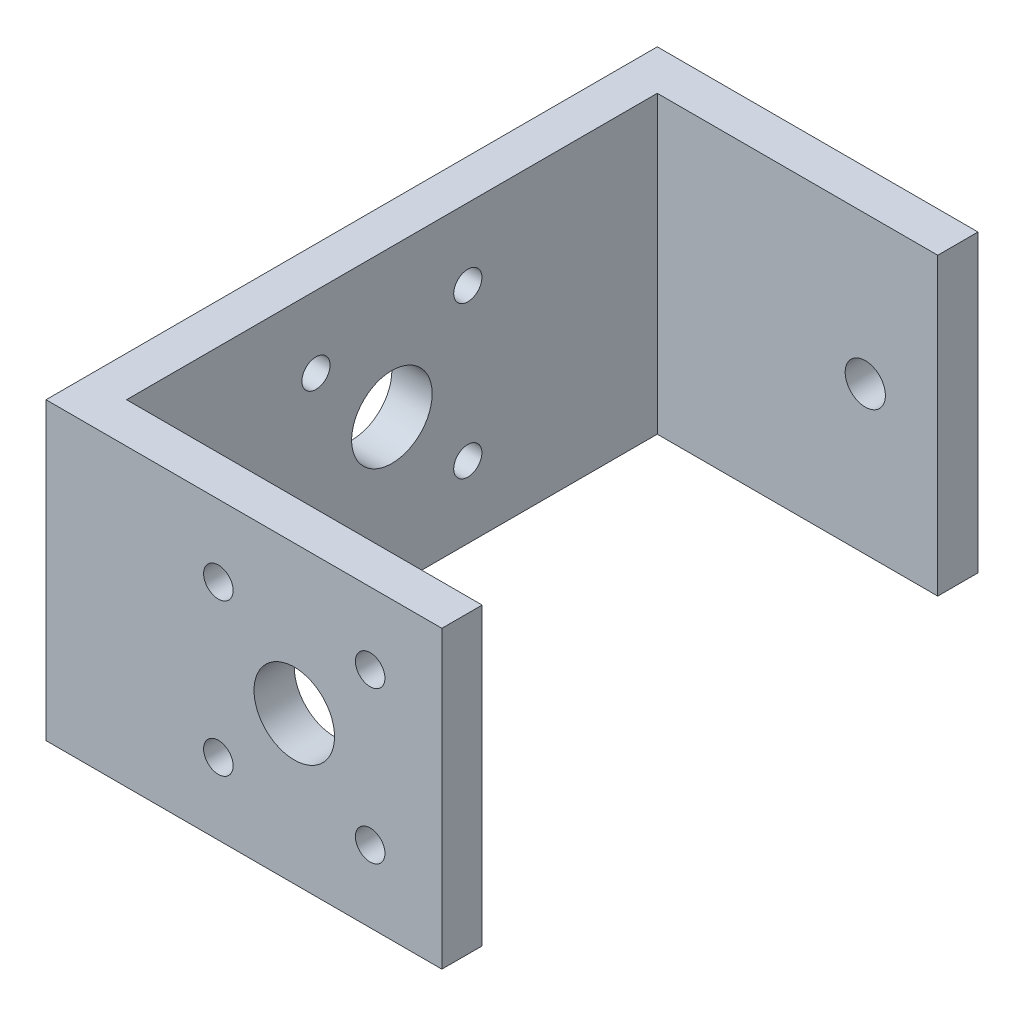
ISO-10303-21;
HEADER;
FILE_DESCRIPTION(('STEP AP214'),'2;1');
FILE_NAME('part.step','',(''),(''),'','','');
FILE_SCHEMA(('AUTOMOTIVE_DESIGN { 1 0 10303 214 1 1 1 1 }'));
ENDSEC;
DATA;
#1=APPLICATION_CONTEXT('core data for automotive mechanical design processes');
#2=APPLICATION_PROTOCOL_DEFINITION('international standard','automotive_design',2000,#1);
#3=PRODUCT_CONTEXT('',#1,'mechanical');
#4=PRODUCT('Part','Part','',(#3));
#5=PRODUCT_RELATED_PRODUCT_CATEGORY('part','',(#4));
#6=PRODUCT_DEFINITION_FORMATION('','',#4);
#7=PRODUCT_DEFINITION_CONTEXT('part definition',#1,'design');
#8=PRODUCT_DEFINITION('design','',#6,#7);
#9=PRODUCT_DEFINITION_SHAPE('','',#8);
#10=(LENGTH_UNIT() NAMED_UNIT(*) SI_UNIT(.MILLI.,.METRE.));
#11=(NAMED_UNIT(*) PLANE_ANGLE_UNIT() SI_UNIT($,.RADIAN.));
#12=(NAMED_UNIT(*) SI_UNIT($,.STERADIAN.) SOLID_ANGLE_UNIT());
#13=UNCERTAINTY_MEASURE_WITH_UNIT(LENGTH_MEASURE(1.E-05),#10,'distance_accuracy_value','');
#14=(GEOMETRIC_REPRESENTATION_CONTEXT(3) GLOBAL_UNCERTAINTY_ASSIGNED_CONTEXT((#13)) GLOBAL_UNIT_ASSIGNED_CONTEXT((#10,
#11,#12)) REPRESENTATION_CONTEXT('',''));
#15=CARTESIAN_POINT('',(0.,0.,0.));
#16=DIRECTION('',(0.,0.,1.));
#17=DIRECTION('',(1.,0.,0.));
#18=AXIS2_PLACEMENT_3D('',#15,#16,#17);
#19=CARTESIAN_POINT('',(3.,11.,0.));
#20=DIRECTION('',(0.,1.,0.));
#21=DIRECTION('',(0.,0.,1.));
#22=AXIS2_PLACEMENT_3D('',#19,#20,#21);
#23=PLANE('',#22);
#24=DIRECTION('',(0.,0.,-1.));
#25=VECTOR('',#24,1.);
#26=CARTESIAN_POINT('',(0.,11.,0.));
#27=LINE('',#26,#25);
#28=CARTESIAN_POINT('',(0.,11.,22.775));
#29=VERTEX_POINT('',#28);
#30=CARTESIAN_POINT('',(0.,11.,-22.775));
#31=VERTEX_POINT('',#30);
#32=EDGE_CURVE('E200',#29,#31,#27,.T.);
#33=ORIENTED_EDGE('',*,*,#32,.F.);
#34=DIRECTION('',(-1.,0.,0.));
#35=VECTOR('',#34,1.);
#36=CARTESIAN_POINT('',(29.5,11.,22.775));
#37=LINE('',#36,#35);
#38=CARTESIAN_POINT('',(29.5,11.,22.775));
#39=VERTEX_POINT('',#38);
#40=EDGE_CURVE('E156',#39,#29,#37,.T.);
#41=ORIENTED_EDGE('',*,*,#40,.F.);
#42=DIRECTION('',(0.,0.,-1.));
#43=VECTOR('',#42,1.);
#44=CARTESIAN_POINT('',(29.5,11.,0.));
#45=LINE('',#44,#43);
#46=CARTESIAN_POINT('',(29.5,11.,19.775));
#47=VERTEX_POINT('',#46);
#48=EDGE_CURVE('E153',#39,#47,#45,.T.);
#49=ORIENTED_EDGE('',*,*,#48,.T.);
#50=DIRECTION('',(-1.,0.,0.));
#51=VECTOR('',#50,1.);
#52=CARTESIAN_POINT('',(29.5,11.,19.775));
#53=LINE('',#52,#51);
#54=CARTESIAN_POINT('',(3.00000000000001,11.,19.775));
#55=VERTEX_POINT('',#54);
#56=EDGE_CURVE('E161',#47,#55,#53,.T.);
#57=ORIENTED_EDGE('',*,*,#56,.T.);
#58=DIRECTION('',(0.,0.,-1.));
#59=VECTOR('',#58,1.);
#60=CARTESIAN_POINT('',(3.,11.,0.));
#61=LINE('',#60,#59);
#62=CARTESIAN_POINT('',(3.,11.,-19.775));
#63=VERTEX_POINT('',#62);
#64=EDGE_CURVE('E113',#55,#63,#61,.T.);
#65=ORIENTED_EDGE('',*,*,#64,.T.);
#66=DIRECTION('',(-1.,0.,0.));
#67=VECTOR('',#66,1.);
#68=CARTESIAN_POINT('',(23.9,11.,-19.775));
#69=LINE('',#68,#67);
#70=CARTESIAN_POINT('',(23.9,11.,-19.775));
#71=VERTEX_POINT('',#70);
#72=EDGE_CURVE('E106',#71,#63,#69,.T.);
#73=ORIENTED_EDGE('',*,*,#72,.F.);
#74=DIRECTION('',(0.,0.,-1.));
#75=VECTOR('',#74,1.);
#76=CARTESIAN_POINT('',(23.9,11.,0.));
#77=LINE('',#76,#75);
#78=CARTESIAN_POINT('',(23.9,11.,-22.775));
#79=VERTEX_POINT('',#78);
#80=EDGE_CURVE('E110',#71,#79,#77,.T.);
#81=ORIENTED_EDGE('',*,*,#80,.T.);
#82=DIRECTION('',(-1.,0.,0.));
#83=VECTOR('',#82,1.);
#84=CARTESIAN_POINT('',(23.9,11.,-22.775));
#85=LINE('',#84,#83);
#86=EDGE_CURVE('E139',#79,#31,#85,.T.);
#87=ORIENTED_EDGE('',*,*,#86,.T.);
#88=EDGE_LOOP('',(#33,#41,#49,#57,#65,#73,#81,#87));
#89=FACE_BOUND('',#88,.T.);
#90=ADVANCED_FACE('F38',(#89),#23,.T.);
#91=CARTESIAN_POINT('',(3.,5.65685424949235,-5.65685424949241));
#92=DIRECTION('',(-1.,0.,0.));
#93=DIRECTION('',(0.,0.,1.));
#94=AXIS2_PLACEMENT_3D('',#91,#92,#93);
#95=CYLINDRICAL_SURFACE('',#94,1.05);
#96=CARTESIAN_POINT('',(3.,5.65685424949235,-5.65685424949241));
#97=DIRECTION('',(1.,0.,0.));
#98=DIRECTION('',(0.,0.,-1.));
#99=AXIS2_PLACEMENT_3D('',#96,#97,#98);
#100=CIRCLE('',#99,1.05);
#101=CARTESIAN_POINT('',(3.,5.65685424949235,-6.70685424949241));
#102=VERTEX_POINT('',#101);
#103=EDGE_CURVE('E180',#102,#102,#100,.T.);
#104=ORIENTED_EDGE('',*,*,#103,.T.);
#105=EDGE_LOOP('',(#104));
#106=FACE_BOUND('',#105,.T.);
#107=CARTESIAN_POINT('',(0.,5.65685424949235,-5.65685424949241));
#108=DIRECTION('',(1.,0.,0.));
#109=DIRECTION('',(0.,0.,-1.));
#110=AXIS2_PLACEMENT_3D('',#107,#108,#109);
#111=CIRCLE('',#110,1.05);
#112=CARTESIAN_POINT('',(0.,5.65685424949235,-6.70685424949241));
#113=VERTEX_POINT('',#112);
#114=EDGE_CURVE('E198',#113,#113,#111,.T.);
#115=ORIENTED_EDGE('',*,*,#114,.F.);
#116=EDGE_LOOP('',(#115));
#117=FACE_BOUND('',#116,.T.);
#118=ADVANCED_FACE('F228',(#106,#117),#95,.F.);
#119=CARTESIAN_POINT('',(3.,0.,0.));
#120=DIRECTION('',(-1.,0.,0.));
#121=DIRECTION('',(0.,0.,1.));
#122=AXIS2_PLACEMENT_3D('',#119,#120,#121);
#123=CYLINDRICAL_SURFACE('',#122,3.);
#124=CARTESIAN_POINT('',(3.,0.,0.));
#125=DIRECTION('',(1.,0.,0.));
#126=DIRECTION('',(0.,0.,-1.));
#127=AXIS2_PLACEMENT_3D('',#124,#125,#126);
#128=CIRCLE('',#127,3.);
#129=CARTESIAN_POINT('',(3.,0.,-3.));
#130=VERTEX_POINT('',#129);
#131=EDGE_CURVE('E177',#130,#130,#128,.T.);
#132=ORIENTED_EDGE('',*,*,#131,.T.);
#133=EDGE_LOOP('',(#132));
#134=FACE_BOUND('',#133,.T.);
#135=CARTESIAN_POINT('',(0.,0.,0.));
#136=DIRECTION('',(1.,0.,0.));
#137=DIRECTION('',(0.,0.,-1.));
#138=AXIS2_PLACEMENT_3D('',#135,#136,#137);
#139=CIRCLE('',#138,3.);
#140=CARTESIAN_POINT('',(0.,0.,-3.));
#141=VERTEX_POINT('',#140);
#142=EDGE_CURVE('E195',#141,#141,#139,.T.);
#143=ORIENTED_EDGE('',*,*,#142,.F.);
#144=EDGE_LOOP('',(#143));
#145=FACE_BOUND('',#144,.T.);
#146=ADVANCED_FACE('F233',(#134,#145),#123,.F.);
#147=CARTESIAN_POINT('',(3.,-5.65685424949241,-5.65685424949266));
#148=DIRECTION('',(-1.,0.,0.));
#149=DIRECTION('',(0.,0.,1.));
#150=AXIS2_PLACEMENT_3D('',#147,#148,#149);
#151=CYLINDRICAL_SURFACE('',#150,1.04999999999992);
#152=CARTESIAN_POINT('',(3.,-5.65685424949241,-5.65685424949266));
#153=DIRECTION('',(1.,0.,0.));
#154=DIRECTION('',(0.,0.,-1.));
#155=AXIS2_PLACEMENT_3D('',#152,#153,#154);
#156=CIRCLE('',#155,1.04999999999992);
#157=CARTESIAN_POINT('',(3.,-5.65685424949241,-6.70685424949258));
#158=VERTEX_POINT('',#157);
#159=EDGE_CURVE('E174',#158,#158,#156,.T.);
#160=ORIENTED_EDGE('',*,*,#159,.T.);
#161=EDGE_LOOP('',(#160));
#162=FACE_BOUND('',#161,.T.);
#163=CARTESIAN_POINT('',(0.,-5.65685424949241,-5.65685424949266));
#164=DIRECTION('',(1.,0.,0.));
#165=DIRECTION('',(0.,0.,-1.));
#166=AXIS2_PLACEMENT_3D('',#163,#164,#165);
#167=CIRCLE('',#166,1.04999999999992);
#168=CARTESIAN_POINT('',(0.,-5.65685424949241,-6.70685424949258));
#169=VERTEX_POINT('',#168);
#170=EDGE_CURVE('E192',#169,#169,#167,.T.);
#171=ORIENTED_EDGE('',*,*,#170,.F.);
#172=EDGE_LOOP('',(#171));
#173=FACE_BOUND('',#172,.T.);
#174=ADVANCED_FACE('F239',(#162,#173),#151,.F.);
#175=CARTESIAN_POINT('',(3.,-5.65685424949266,5.6568542494921));
#176=DIRECTION('',(-1.,0.,0.));
#177=DIRECTION('',(0.,0.,1.));
#178=AXIS2_PLACEMENT_3D('',#175,#176,#177);
#179=CYLINDRICAL_SURFACE('',#178,1.05000000000023);
#180=CARTESIAN_POINT('',(3.,-5.65685424949266,5.6568542494921));
#181=DIRECTION('',(1.,0.,0.));
#182=DIRECTION('',(0.,0.,-1.));
#183=AXIS2_PLACEMENT_3D('',#180,#181,#182);
#184=CIRCLE('',#183,1.05000000000023);
#185=CARTESIAN_POINT('',(3.,-5.65685424949266,4.60685424949186));
#186=VERTEX_POINT('',#185);
#187=EDGE_CURVE('E171',#186,#186,#184,.T.);
#188=ORIENTED_EDGE('',*,*,#187,.T.);
#189=EDGE_LOOP('',(#188));
#190=FACE_BOUND('',#189,.T.);
#191=CARTESIAN_POINT('',(0.,-5.65685424949266,5.6568542494921));
#192=DIRECTION('',(1.,0.,0.));
#193=DIRECTION('',(0.,0.,-1.));
#194=AXIS2_PLACEMENT_3D('',#191,#192,#193);
#195=CIRCLE('',#194,1.05000000000023);
#196=CARTESIAN_POINT('',(0.,-5.65685424949266,4.60685424949186));
#197=VERTEX_POINT('',#196);
#198=EDGE_CURVE('E189',#197,#197,#195,.T.);
#199=ORIENTED_EDGE('',*,*,#198,.F.);
#200=EDGE_LOOP('',(#199));
#201=FACE_BOUND('',#200,.T.);
#202=ADVANCED_FACE('F242',(#190,#201),#179,.F.);
#203=CARTESIAN_POINT('',(3.,5.6568542494921,5.65685424949235));
#204=DIRECTION('',(-1.,0.,0.));
#205=DIRECTION('',(0.,0.,1.));
#206=AXIS2_PLACEMENT_3D('',#203,#204,#205);
#207=CYLINDRICAL_SURFACE('',#206,1.05000000000034);
#208=CARTESIAN_POINT('',(3.,5.6568542494921,5.65685424949235));
#209=DIRECTION('',(1.,0.,0.));
#210=DIRECTION('',(0.,0.,-1.));
#211=AXIS2_PLACEMENT_3D('',#208,#209,#210);
#212=CIRCLE('',#211,1.05000000000034);
#213=CARTESIAN_POINT('',(3.,5.6568542494921,4.60685424949201));
#214=VERTEX_POINT('',#213);
#215=EDGE_CURVE('E168',#214,#214,#212,.T.);
#216=ORIENTED_EDGE('',*,*,#215,.T.);
#217=EDGE_LOOP('',(#216));
#218=FACE_BOUND('',#217,.T.);
#219=CARTESIAN_POINT('',(0.,5.6568542494921,5.65685424949235));
#220=DIRECTION('',(1.,0.,0.));
#221=DIRECTION('',(0.,0.,-1.));
#222=AXIS2_PLACEMENT_3D('',#219,#220,#221);
#223=CIRCLE('',#222,1.05000000000034);
#224=CARTESIAN_POINT('',(0.,5.6568542494921,4.60685424949201));
#225=VERTEX_POINT('',#224);
#226=EDGE_CURVE('E167',#225,#225,#223,.T.);
#227=ORIENTED_EDGE('',*,*,#226,.F.);
#228=EDGE_LOOP('',(#227));
#229=FACE_BOUND('',#228,.T.);
#230=ADVANCED_FACE('F40',(#218,#229),#207,.F.);
#231=CARTESIAN_POINT('',(3.,-11.,0.));
#232=DIRECTION('',(0.,1.,0.));
#233=DIRECTION('',(0.,0.,1.));
#234=AXIS2_PLACEMENT_3D('',#231,#232,#233);
#235=PLANE('',#234);
#236=DIRECTION('',(0.,0.,-1.));
#237=VECTOR('',#236,1.);
#238=CARTESIAN_POINT('',(0.,-11.,0.));
#239=LINE('',#238,#237);
#240=CARTESIAN_POINT('',(0.,-11.,22.775));
#241=VERTEX_POINT('',#240);
#242=CARTESIAN_POINT('',(0.,-11.,-22.775));
#243=VERTEX_POINT('',#242);
#244=EDGE_CURVE('E42',#241,#243,#239,.T.);
#245=ORIENTED_EDGE('',*,*,#244,.T.);
#246=DIRECTION('',(-1.,0.,0.));
#247=VECTOR('',#246,1.);
#248=CARTESIAN_POINT('',(23.9,-11.,-22.775));
#249=LINE('',#248,#247);
#250=CARTESIAN_POINT('',(23.9,-11.,-22.775));
#251=VERTEX_POINT('',#250);
#252=EDGE_CURVE('E142',#251,#243,#249,.T.);
#253=ORIENTED_EDGE('',*,*,#252,.F.);
#254=DIRECTION('',(0.,0.,-1.));
#255=VECTOR('',#254,1.);
#256=CARTESIAN_POINT('',(23.9,-11.,0.));
#257=LINE('',#256,#255);
#258=CARTESIAN_POINT('',(23.9,-11.,-19.775));
#259=VERTEX_POINT('',#258);
#260=EDGE_CURVE('E124',#259,#251,#257,.T.);
#261=ORIENTED_EDGE('',*,*,#260,.F.);
#262=DIRECTION('',(-1.,0.,0.));
#263=VECTOR('',#262,1.);
#264=CARTESIAN_POINT('',(23.9,-11.,-19.775));
#265=LINE('',#264,#263);
#266=CARTESIAN_POINT('',(3.00000000000001,-11.,-19.775));
#267=VERTEX_POINT('',#266);
#268=EDGE_CURVE('E116',#259,#267,#265,.T.);
#269=ORIENTED_EDGE('',*,*,#268,.T.);
#270=DIRECTION('',(0.,0.,-1.));
#271=VECTOR('',#270,1.);
#272=CARTESIAN_POINT('',(3.,-11.,0.));
#273=LINE('',#272,#271);
#274=CARTESIAN_POINT('',(3.,-11.,19.775));
#275=VERTEX_POINT('',#274);
#276=EDGE_CURVE('E11',#275,#267,#273,.T.);
#277=ORIENTED_EDGE('',*,*,#276,.F.);
#278=DIRECTION('',(-1.,0.,0.));
#279=VECTOR('',#278,1.);
#280=CARTESIAN_POINT('',(29.5,-11.,19.775));
#281=LINE('',#280,#279);
#282=CARTESIAN_POINT('',(29.5,-11.,19.775));
#283=VERTEX_POINT('',#282);
#284=EDGE_CURVE('E55',#283,#275,#281,.T.);
#285=ORIENTED_EDGE('',*,*,#284,.F.);
#286=DIRECTION('',(0.,0.,-1.));
#287=VECTOR('',#286,1.);
#288=CARTESIAN_POINT('',(29.5,-11.,0.));
#289=LINE('',#288,#287);
#290=CARTESIAN_POINT('',(29.5,-11.,22.775));
#291=VERTEX_POINT('',#290);
#292=EDGE_CURVE('E149',#291,#283,#289,.T.);
#293=ORIENTED_EDGE('',*,*,#292,.F.);
#294=DIRECTION('',(-1.,0.,0.));
#295=VECTOR('',#294,1.);
#296=CARTESIAN_POINT('',(29.5,-11.,22.775));
#297=LINE('',#296,#295);
#298=EDGE_CURVE('E164',#291,#241,#297,.T.);
#299=ORIENTED_EDGE('',*,*,#298,.T.);
#300=EDGE_LOOP('',(#245,#253,#261,#269,#277,#285,#293,#299));
#301=FACE_BOUND('',#300,.T.);
#302=ADVANCED_FACE('F205',(#301),#235,.F.);
#303=CARTESIAN_POINT('',(3.,0.,0.));
#304=DIRECTION('',(1.,0.,0.));
#305=DIRECTION('',(0.,0.,-1.));
#306=AXIS2_PLACEMENT_3D('',#303,#304,#305);
#307=PLANE('',#306);
#308=ORIENTED_EDGE('',*,*,#215,.F.);
#309=EDGE_LOOP('',(#308));
#310=FACE_BOUND('',#309,.T.);
#311=ORIENTED_EDGE('',*,*,#187,.F.);
#312=EDGE_LOOP('',(#311));
#313=FACE_BOUND('',#312,.T.);
#314=ORIENTED_EDGE('',*,*,#159,.F.);
#315=EDGE_LOOP('',(#314));
#316=FACE_BOUND('',#315,.T.);
#317=ORIENTED_EDGE('',*,*,#131,.F.);
#318=EDGE_LOOP('',(#317));
#319=FACE_BOUND('',#318,.T.);
#320=ORIENTED_EDGE('',*,*,#103,.F.);
#321=EDGE_LOOP('',(#320));
#322=FACE_BOUND('',#321,.T.);
#323=DIRECTION('',(0.,-1.,0.));
#324=VECTOR('',#323,1.);
#325=CARTESIAN_POINT('',(3.,0.,-19.775));
#326=LINE('',#325,#324);
#327=EDGE_CURVE('E62',#63,#267,#326,.T.);
#328=ORIENTED_EDGE('',*,*,#327,.F.);
#329=ORIENTED_EDGE('',*,*,#64,.F.);
#330=DIRECTION('',(0.,-1.,0.));
#331=VECTOR('',#330,1.);
#332=CARTESIAN_POINT('',(3.,0.,19.775));
#333=LINE('',#332,#331);
#334=EDGE_CURVE('E47',#55,#275,#333,.T.);
#335=ORIENTED_EDGE('',*,*,#334,.T.);
#336=ORIENTED_EDGE('',*,*,#276,.T.);
#337=EDGE_LOOP('',(#328,#329,#335,#336));
#338=FACE_BOUND('',#337,.T.);
#339=ADVANCED_FACE('F213',(#310,#313,#316,#319,#322,#338),#307,.T.);
#340=CARTESIAN_POINT('',(0.,0.,0.));
#341=DIRECTION('',(1.,0.,0.));
#342=DIRECTION('',(0.,0.,-1.));
#343=AXIS2_PLACEMENT_3D('',#340,#341,#342);
#344=PLANE('',#343);
#345=ORIENTED_EDGE('',*,*,#226,.T.);
#346=EDGE_LOOP('',(#345));
#347=FACE_BOUND('',#346,.T.);
#348=ORIENTED_EDGE('',*,*,#198,.T.);
#349=EDGE_LOOP('',(#348));
#350=FACE_BOUND('',#349,.T.);
#351=ORIENTED_EDGE('',*,*,#170,.T.);
#352=EDGE_LOOP('',(#351));
#353=FACE_BOUND('',#352,.T.);
#354=ORIENTED_EDGE('',*,*,#142,.T.);
#355=EDGE_LOOP('',(#354));
#356=FACE_BOUND('',#355,.T.);
#357=ORIENTED_EDGE('',*,*,#114,.T.);
#358=EDGE_LOOP('',(#357));
#359=FACE_BOUND('',#358,.T.);
#360=ORIENTED_EDGE('',*,*,#32,.T.);
#361=DIRECTION('',(0.,-1.,0.));
#362=VECTOR('',#361,1.);
#363=CARTESIAN_POINT('',(0.,0.,-22.775));
#364=LINE('',#363,#362);
#365=EDGE_CURVE('E129',#31,#243,#364,.T.);
#366=ORIENTED_EDGE('',*,*,#365,.T.);
#367=ORIENTED_EDGE('',*,*,#244,.F.);
#368=DIRECTION('',(0.,-1.,0.));
#369=VECTOR('',#368,1.);
#370=CARTESIAN_POINT('',(0.,0.,22.775));
#371=LINE('',#370,#369);
#372=EDGE_CURVE('E115',#29,#241,#371,.T.);
#373=ORIENTED_EDGE('',*,*,#372,.F.);
#374=EDGE_LOOP('',(#360,#366,#367,#373));
#375=FACE_BOUND('',#374,.T.);
#376=ADVANCED_FACE('F210',(#347,#350,#353,#356,#359,#375),#344,.F.);
#377=CARTESIAN_POINT('',(29.5,0.,19.775));
#378=DIRECTION('',(0.,0.,-1.));
#379=DIRECTION('',(0.,1.,0.));
#380=AXIS2_PLACEMENT_3D('',#377,#378,#379);
#381=PLANE('',#380);
#382=CARTESIAN_POINT('',(24.1568542494924,-5.65685424949233,19.775));
#383=DIRECTION('',(0.,0.,-1.));
#384=DIRECTION('',(0.,1.,0.));
#385=AXIS2_PLACEMENT_3D('',#382,#383,#384);
#386=CIRCLE('',#385,1.1);
#387=CARTESIAN_POINT('',(24.1568542494924,-4.55685424949233,19.775));
#388=VERTEX_POINT('',#387);
#389=EDGE_CURVE('E469',#388,#388,#386,.F.);
#390=ORIENTED_EDGE('',*,*,#389,.T.);
#391=EDGE_LOOP('',(#390));
#392=FACE_BOUND('',#391,.T.);
#393=CARTESIAN_POINT('',(12.8431457505076,5.65685424949236,19.775));
#394=DIRECTION('',(0.,0.,-1.));
#395=DIRECTION('',(0.,1.,0.));
#396=AXIS2_PLACEMENT_3D('',#393,#394,#395);
#397=CIRCLE('',#396,1.1);
#398=CARTESIAN_POINT('',(12.8431457505076,6.75685424949236,19.775));
#399=VERTEX_POINT('',#398);
#400=EDGE_CURVE('E475',#399,#399,#397,.F.);
#401=ORIENTED_EDGE('',*,*,#400,.T.);
#402=EDGE_LOOP('',(#401));
#403=FACE_BOUND('',#402,.T.);
#404=CARTESIAN_POINT('',(12.8431457505076,-5.65685424949239,19.775));
#405=DIRECTION('',(0.,0.,-1.));
#406=DIRECTION('',(0.,1.,0.));
#407=AXIS2_PLACEMENT_3D('',#404,#405,#406);
#408=CIRCLE('',#407,1.1);
#409=CARTESIAN_POINT('',(12.8431457505076,-4.55685424949239,19.775));
#410=VERTEX_POINT('',#409);
#411=EDGE_CURVE('E468',#410,#410,#408,.F.);
#412=ORIENTED_EDGE('',*,*,#411,.T.);
#413=EDGE_LOOP('',(#412));
#414=FACE_BOUND('',#413,.T.);
#415=CARTESIAN_POINT('',(18.5,0.,19.775));
#416=DIRECTION('',(0.,0.,-1.));
#417=DIRECTION('',(0.,1.,0.));
#418=AXIS2_PLACEMENT_3D('',#415,#416,#417);
#419=CIRCLE('',#418,3.);
#420=CARTESIAN_POINT('',(18.5,3.,19.775));
#421=VERTEX_POINT('',#420);
#422=EDGE_CURVE('E132',#421,#421,#419,.F.);
#423=ORIENTED_EDGE('',*,*,#422,.T.);
#424=EDGE_LOOP('',(#423));
#425=FACE_BOUND('',#424,.T.);
#426=CARTESIAN_POINT('',(24.1568542494924,5.65685424949238,19.775));
#427=DIRECTION('',(0.,0.,-1.));
#428=DIRECTION('',(0.,1.,0.));
#429=AXIS2_PLACEMENT_3D('',#426,#427,#428);
#430=CIRCLE('',#429,1.1);
#431=CARTESIAN_POINT('',(24.1568542494924,6.75685424949238,19.775));
#432=VERTEX_POINT('',#431);
#433=EDGE_CURVE('E135',#432,#432,#430,.F.);
#434=ORIENTED_EDGE('',*,*,#433,.T.);
#435=EDGE_LOOP('',(#434));
#436=FACE_BOUND('',#435,.T.);
#437=ORIENTED_EDGE('',*,*,#334,.F.);
#438=ORIENTED_EDGE('',*,*,#56,.F.);
#439=DIRECTION('',(0.,-1.,0.));
#440=VECTOR('',#439,1.);
#441=CARTESIAN_POINT('',(29.5,0.,19.775));
#442=LINE('',#441,#440);
#443=EDGE_CURVE('E151',#47,#283,#442,.T.);
#444=ORIENTED_EDGE('',*,*,#443,.T.);
#445=ORIENTED_EDGE('',*,*,#284,.T.);
#446=EDGE_LOOP('',(#437,#438,#444,#445));
#447=FACE_BOUND('',#446,.T.);
#448=ADVANCED_FACE('F212',(#392,#403,#414,#425,#436,#447),#381,.T.);
#449=CARTESIAN_POINT('',(29.5,0.,22.775));
#450=DIRECTION('',(0.,0.,-1.));
#451=DIRECTION('',(0.,1.,0.));
#452=AXIS2_PLACEMENT_3D('',#449,#450,#451);
#453=PLANE('',#452);
#454=CARTESIAN_POINT('',(24.1568542494924,-5.65685424949233,22.775));
#455=DIRECTION('',(0.,0.,1.));
#456=DIRECTION('',(0.,-1.,0.));
#457=AXIS2_PLACEMENT_3D('',#454,#455,#456);
#458=CIRCLE('',#457,1.1);
#459=CARTESIAN_POINT('',(24.1568542494925,-6.75685424949233,22.775));
#460=VERTEX_POINT('',#459);
#461=EDGE_CURVE('E462',#460,#460,#458,.T.);
#462=ORIENTED_EDGE('',*,*,#461,.F.);
#463=EDGE_LOOP('',(#462));
#464=FACE_BOUND('',#463,.T.);
#465=CARTESIAN_POINT('',(12.8431457505076,5.65685424949236,22.775));
#466=DIRECTION('',(0.,0.,1.));
#467=DIRECTION('',(0.,1.,0.));
#468=AXIS2_PLACEMENT_3D('',#465,#466,#467);
#469=CIRCLE('',#468,1.1);
#470=CARTESIAN_POINT('',(12.8431457505076,6.75685424949236,22.775));
#471=VERTEX_POINT('',#470);
#472=EDGE_CURVE('E472',#471,#471,#469,.T.);
#473=ORIENTED_EDGE('',*,*,#472,.F.);
#474=EDGE_LOOP('',(#473));
#475=FACE_BOUND('',#474,.T.);
#476=CARTESIAN_POINT('',(12.8431457505076,-5.65685424949239,22.775));
#477=DIRECTION('',(0.,0.,1.));
#478=DIRECTION('',(-1.,0.,0.));
#479=AXIS2_PLACEMENT_3D('',#476,#477,#478);
#480=CIRCLE('',#479,1.1);
#481=CARTESIAN_POINT('',(11.7431457505076,-5.65685424949239,22.775));
#482=VERTEX_POINT('',#481);
#483=EDGE_CURVE('E465',#482,#482,#480,.T.);
#484=ORIENTED_EDGE('',*,*,#483,.F.);
#485=EDGE_LOOP('',(#484));
#486=FACE_BOUND('',#485,.T.);
#487=CARTESIAN_POINT('',(18.5,0.,22.775));
#488=DIRECTION('',(0.,0.,1.));
#489=DIRECTION('',(1.,0.,0.));
#490=AXIS2_PLACEMENT_3D('',#487,#488,#489);
#491=CIRCLE('',#490,3.);
#492=CARTESIAN_POINT('',(21.5,0.,22.775));
#493=VERTEX_POINT('',#492);
#494=EDGE_CURVE('E483',#493,#493,#491,.T.);
#495=ORIENTED_EDGE('',*,*,#494,.F.);
#496=EDGE_LOOP('',(#495));
#497=FACE_BOUND('',#496,.T.);
#498=CARTESIAN_POINT('',(24.1568542494924,5.65685424949238,22.775));
#499=DIRECTION('',(0.,0.,1.));
#500=DIRECTION('',(1.,0.,0.));
#501=AXIS2_PLACEMENT_3D('',#498,#499,#500);
#502=CIRCLE('',#501,1.1);
#503=CARTESIAN_POINT('',(25.2568542494924,5.65685424949238,22.775));
#504=VERTEX_POINT('',#503);
#505=EDGE_CURVE('E478',#504,#504,#502,.T.);
#506=ORIENTED_EDGE('',*,*,#505,.F.);
#507=EDGE_LOOP('',(#506));
#508=FACE_BOUND('',#507,.T.);
#509=ORIENTED_EDGE('',*,*,#372,.T.);
#510=ORIENTED_EDGE('',*,*,#298,.F.);
#511=DIRECTION('',(0.,-1.,0.));
#512=VECTOR('',#511,1.);
#513=CARTESIAN_POINT('',(29.5,0.,22.775));
#514=LINE('',#513,#512);
#515=EDGE_CURVE('E146',#39,#291,#514,.T.);
#516=ORIENTED_EDGE('',*,*,#515,.F.);
#517=ORIENTED_EDGE('',*,*,#40,.T.);
#518=EDGE_LOOP('',(#509,#510,#516,#517));
#519=FACE_BOUND('',#518,.T.);
#520=ADVANCED_FACE('F220',(#464,#475,#486,#497,#508,#519),#453,.F.);
#521=CARTESIAN_POINT('',(29.5,0.,0.));
#522=DIRECTION('',(1.,0.,0.));
#523=DIRECTION('',(0.,0.,-1.));
#524=AXIS2_PLACEMENT_3D('',#521,#522,#523);
#525=PLANE('',#524);
#526=ORIENTED_EDGE('',*,*,#515,.T.);
#527=ORIENTED_EDGE('',*,*,#292,.T.);
#528=ORIENTED_EDGE('',*,*,#443,.F.);
#529=ORIENTED_EDGE('',*,*,#48,.F.);
#530=EDGE_LOOP('',(#526,#527,#528,#529));
#531=FACE_BOUND('',#530,.T.);
#532=ADVANCED_FACE('F337',(#531),#525,.T.);
#533=CARTESIAN_POINT('',(23.9,0.,-19.775));
#534=DIRECTION('',(0.,0.,-1.));
#535=DIRECTION('',(0.,1.,0.));
#536=AXIS2_PLACEMENT_3D('',#533,#534,#535);
#537=PLANE('',#536);
#538=CARTESIAN_POINT('',(18.5,0.,-19.775));
#539=DIRECTION('',(0.,0.,-1.));
#540=DIRECTION('',(0.,1.,0.));
#541=AXIS2_PLACEMENT_3D('',#538,#539,#540);
#542=CIRCLE('',#541,1.5);
#543=CARTESIAN_POINT('',(18.5,1.5,-19.775));
#544=VERTEX_POINT('',#543);
#545=EDGE_CURVE('E457',#544,#544,#542,.F.);
#546=ORIENTED_EDGE('',*,*,#545,.F.);
#547=EDGE_LOOP('',(#546));
#548=FACE_BOUND('',#547,.T.);
#549=ORIENTED_EDGE('',*,*,#72,.T.);
#550=ORIENTED_EDGE('',*,*,#327,.T.);
#551=ORIENTED_EDGE('',*,*,#268,.F.);
#552=DIRECTION('',(0.,-1.,0.));
#553=VECTOR('',#552,1.);
#554=CARTESIAN_POINT('',(23.9,0.,-19.775));
#555=LINE('',#554,#553);
#556=EDGE_CURVE('E119',#71,#259,#555,.T.);
#557=ORIENTED_EDGE('',*,*,#556,.F.);
#558=EDGE_LOOP('',(#549,#550,#551,#557));
#559=FACE_BOUND('',#558,.T.);
#560=ADVANCED_FACE('F120',(#548,#559),#537,.F.);
#561=CARTESIAN_POINT('',(23.9,0.,-22.775));
#562=DIRECTION('',(0.,0.,-1.));
#563=DIRECTION('',(0.,1.,0.));
#564=AXIS2_PLACEMENT_3D('',#561,#562,#563);
#565=PLANE('',#564);
#566=CARTESIAN_POINT('',(18.5,0.,-22.775));
#567=DIRECTION('',(0.,0.,-1.));
#568=DIRECTION('',(-1.,0.,0.));
#569=AXIS2_PLACEMENT_3D('',#566,#567,#568);
#570=CIRCLE('',#569,1.5);
#571=CARTESIAN_POINT('',(17.,0.,-22.775));
#572=VERTEX_POINT('',#571);
#573=EDGE_CURVE('E460',#572,#572,#570,.T.);
#574=ORIENTED_EDGE('',*,*,#573,.F.);
#575=EDGE_LOOP('',(#574));
#576=FACE_BOUND('',#575,.T.);
#577=ORIENTED_EDGE('',*,*,#365,.F.);
#578=ORIENTED_EDGE('',*,*,#86,.F.);
#579=DIRECTION('',(0.,-1.,0.));
#580=VECTOR('',#579,1.);
#581=CARTESIAN_POINT('',(23.9,0.,-22.775));
#582=LINE('',#581,#580);
#583=EDGE_CURVE('E128',#79,#251,#582,.T.);
#584=ORIENTED_EDGE('',*,*,#583,.T.);
#585=ORIENTED_EDGE('',*,*,#252,.T.);
#586=EDGE_LOOP('',(#577,#578,#584,#585));
#587=FACE_BOUND('',#586,.T.);
#588=ADVANCED_FACE('F209',(#576,#587),#565,.T.);
#589=CARTESIAN_POINT('',(23.9,0.,0.));
#590=DIRECTION('',(1.,0.,0.));
#591=DIRECTION('',(0.,0.,-1.));
#592=AXIS2_PLACEMENT_3D('',#589,#590,#591);
#593=PLANE('',#592);
#594=ORIENTED_EDGE('',*,*,#80,.F.);
#595=ORIENTED_EDGE('',*,*,#556,.T.);
#596=ORIENTED_EDGE('',*,*,#260,.T.);
#597=ORIENTED_EDGE('',*,*,#583,.F.);
#598=EDGE_LOOP('',(#594,#595,#596,#597));
#599=FACE_BOUND('',#598,.T.);
#600=ADVANCED_FACE('F126',(#599),#593,.T.);
#601=CARTESIAN_POINT('',(24.1568542494924,5.65685424949238,11.2897186257614));
#602=DIRECTION('',(0.,0.,1.));
#603=DIRECTION('',(1.,0.,0.));
#604=AXIS2_PLACEMENT_3D('',#601,#602,#603);
#605=CYLINDRICAL_SURFACE('',#604,1.1);
#606=ORIENTED_EDGE('',*,*,#505,.T.);
#607=EDGE_LOOP('',(#606));
#608=FACE_BOUND('',#607,.T.);
#609=ORIENTED_EDGE('',*,*,#433,.F.);
#610=EDGE_LOOP('',(#609));
#611=FACE_BOUND('',#610,.T.);
#612=ADVANCED_FACE('F298',(#608,#611),#605,.F.);
#613=CARTESIAN_POINT('',(18.5,0.,11.2897186257614));
#614=DIRECTION('',(0.,0.,1.));
#615=DIRECTION('',(1.,0.,0.));
#616=AXIS2_PLACEMENT_3D('',#613,#614,#615);
#617=CYLINDRICAL_SURFACE('',#616,3.);
#618=ORIENTED_EDGE('',*,*,#494,.T.);
#619=EDGE_LOOP('',(#618));
#620=FACE_BOUND('',#619,.T.);
#621=ORIENTED_EDGE('',*,*,#422,.F.);
#622=EDGE_LOOP('',(#621));
#623=FACE_BOUND('',#622,.T.);
#624=ADVANCED_FACE('F309',(#620,#623),#617,.F.);
#625=CARTESIAN_POINT('',(12.8431457505076,-5.65685424949239,11.2897186257614));
#626=DIRECTION('',(0.,0.,1.));
#627=DIRECTION('',(1.,0.,0.));
#628=AXIS2_PLACEMENT_3D('',#625,#626,#627);
#629=CYLINDRICAL_SURFACE('',#628,1.1);
#630=ORIENTED_EDGE('',*,*,#483,.T.);
#631=EDGE_LOOP('',(#630));
#632=FACE_BOUND('',#631,.T.);
#633=ORIENTED_EDGE('',*,*,#411,.F.);
#634=EDGE_LOOP('',(#633));
#635=FACE_BOUND('',#634,.T.);
#636=ADVANCED_FACE('F319',(#632,#635),#629,.F.);
#637=CARTESIAN_POINT('',(12.8431457505076,5.65685424949236,11.2897186257614));
#638=DIRECTION('',(0.,0.,1.));
#639=DIRECTION('',(1.,0.,0.));
#640=AXIS2_PLACEMENT_3D('',#637,#638,#639);
#641=CYLINDRICAL_SURFACE('',#640,1.1);
#642=ORIENTED_EDGE('',*,*,#472,.T.);
#643=EDGE_LOOP('',(#642));
#644=FACE_BOUND('',#643,.T.);
#645=ORIENTED_EDGE('',*,*,#400,.F.);
#646=EDGE_LOOP('',(#645));
#647=FACE_BOUND('',#646,.T.);
#648=ADVANCED_FACE('F347',(#644,#647),#641,.F.);
#649=CARTESIAN_POINT('',(24.1568542494924,-5.65685424949233,11.2897186257614));
#650=DIRECTION('',(0.,0.,1.));
#651=DIRECTION('',(1.,0.,0.));
#652=AXIS2_PLACEMENT_3D('',#649,#650,#651);
#653=CYLINDRICAL_SURFACE('',#652,1.1);
#654=ORIENTED_EDGE('',*,*,#461,.T.);
#655=EDGE_LOOP('',(#654));
#656=FACE_BOUND('',#655,.T.);
#657=ORIENTED_EDGE('',*,*,#389,.F.);
#658=EDGE_LOOP('',(#657));
#659=FACE_BOUND('',#658,.T.);
#660=ADVANCED_FACE('F357',(#656,#659),#653,.F.);
#661=CARTESIAN_POINT('',(18.5,0.,-15.5323593128807));
#662=DIRECTION('',(0.,0.,-1.));
#663=DIRECTION('',(-1.,0.,0.));
#664=AXIS2_PLACEMENT_3D('',#661,#662,#663);
#665=CYLINDRICAL_SURFACE('',#664,1.5);
#666=ORIENTED_EDGE('',*,*,#545,.T.);
#667=EDGE_LOOP('',(#666));
#668=FACE_BOUND('',#667,.T.);
#669=ORIENTED_EDGE('',*,*,#573,.T.);
#670=EDGE_LOOP('',(#669));
#671=FACE_BOUND('',#670,.T.);
#672=ADVANCED_FACE('F367',(#668,#671),#665,.F.);
#673=CLOSED_SHELL('',(#90,#118,#146,#174,#202,#230,#302,#339,#376,#448,#520,#532,#560,#588,#600,
#612,#624,#636,#648,#660,#672));
#674=MANIFOLD_SOLID_BREP('B2',#673);
#675=ADVANCED_BREP_SHAPE_REPRESENTATION('',(#18,#674),#14);
#676=SHAPE_DEFINITION_REPRESENTATION(#9,#675);
ENDSEC;
END-ISO-10303-21;
